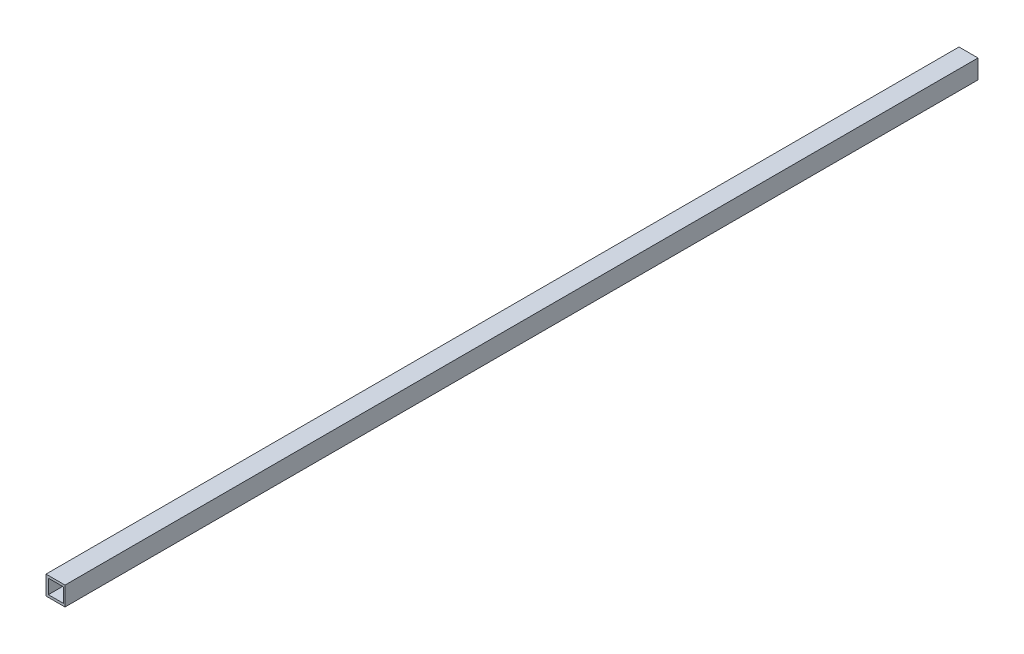
ISO-10303-21;
HEADER;
FILE_DESCRIPTION(('STEP AP214'),'2;1');
FILE_NAME('part.step','',(''),(''),'','','');
FILE_SCHEMA(('AUTOMOTIVE_DESIGN { 1 0 10303 214 1 1 1 1 }'));
ENDSEC;
DATA;
#1=APPLICATION_CONTEXT('core data for automotive mechanical design processes');
#2=APPLICATION_PROTOCOL_DEFINITION('international standard','automotive_design',2000,#1);
#3=PRODUCT_CONTEXT('',#1,'mechanical');
#4=PRODUCT('Part','Part','',(#3));
#5=PRODUCT_RELATED_PRODUCT_CATEGORY('part','',(#4));
#6=PRODUCT_DEFINITION_FORMATION('','',#4);
#7=PRODUCT_DEFINITION_CONTEXT('part definition',#1,'design');
#8=PRODUCT_DEFINITION('design','',#6,#7);
#9=PRODUCT_DEFINITION_SHAPE('','',#8);
#10=(LENGTH_UNIT() NAMED_UNIT(*) SI_UNIT(.MILLI.,.METRE.));
#11=(NAMED_UNIT(*) PLANE_ANGLE_UNIT() SI_UNIT($,.RADIAN.));
#12=(NAMED_UNIT(*) SI_UNIT($,.STERADIAN.) SOLID_ANGLE_UNIT());
#13=UNCERTAINTY_MEASURE_WITH_UNIT(LENGTH_MEASURE(1.E-05),#10,'distance_accuracy_value','');
#14=(GEOMETRIC_REPRESENTATION_CONTEXT(3) GLOBAL_UNCERTAINTY_ASSIGNED_CONTEXT((#13)) GLOBAL_UNIT_ASSIGNED_CONTEXT((#10,
#11,#12)) REPRESENTATION_CONTEXT('',''));
#15=CARTESIAN_POINT('',(0.,0.,0.));
#16=DIRECTION('',(0.,0.,1.));
#17=DIRECTION('',(1.,0.,0.));
#18=AXIS2_PLACEMENT_3D('',#15,#16,#17);
#19=CARTESIAN_POINT('',(0.,0.,1219.2));
#20=DIRECTION('',(-1.,0.,0.));
#21=DIRECTION('',(0.,-1.,0.));
#22=AXIS2_PLACEMENT_3D('',#19,#20,#21);
#23=PLANE('',#22);
#24=DIRECTION('',(0.,1.,0.));
#25=VECTOR('',#24,1.);
#26=CARTESIAN_POINT('',(0.,0.,0.));
#27=LINE('',#26,#25);
#28=CARTESIAN_POINT('',(0.,0.,0.));
#29=VERTEX_POINT('',#28);
#30=CARTESIAN_POINT('',(0.,25.4,0.));
#31=VERTEX_POINT('',#30);
#32=EDGE_CURVE('E148',#29,#31,#27,.T.);
#33=ORIENTED_EDGE('',*,*,#32,.F.);
#34=DIRECTION('',(0.,0.,-1.));
#35=VECTOR('',#34,1.);
#36=CARTESIAN_POINT('',(0.,0.,1219.2));
#37=LINE('',#36,#35);
#38=CARTESIAN_POINT('',(0.,0.,1219.2));
#39=VERTEX_POINT('',#38);
#40=EDGE_CURVE('E11',#39,#29,#37,.T.);
#41=ORIENTED_EDGE('',*,*,#40,.F.);
#42=DIRECTION('',(0.,1.,0.));
#43=VECTOR('',#42,1.);
#44=CARTESIAN_POINT('',(0.,0.,1219.2));
#45=LINE('',#44,#43);
#46=CARTESIAN_POINT('',(0.,25.4,1219.2));
#47=VERTEX_POINT('',#46);
#48=EDGE_CURVE('E154',#39,#47,#45,.T.);
#49=ORIENTED_EDGE('',*,*,#48,.T.);
#50=DIRECTION('',(0.,0.,-1.));
#51=VECTOR('',#50,1.);
#52=CARTESIAN_POINT('',(0.,25.4,1219.2));
#53=LINE('',#52,#51);
#54=EDGE_CURVE('E42',#47,#31,#53,.T.);
#55=ORIENTED_EDGE('',*,*,#54,.T.);
#56=EDGE_LOOP('',(#33,#41,#49,#55));
#57=FACE_BOUND('',#56,.T.);
#58=ADVANCED_FACE('F39',(#57),#23,.T.);
#59=CARTESIAN_POINT('',(0.,0.,1219.2));
#60=DIRECTION('',(0.,1.,0.));
#61=DIRECTION('',(0.,0.,1.));
#62=AXIS2_PLACEMENT_3D('',#59,#60,#61);
#63=PLANE('',#62);
#64=DIRECTION('',(1.,0.,0.));
#65=VECTOR('',#64,1.);
#66=CARTESIAN_POINT('',(0.,0.,0.));
#67=LINE('',#66,#65);
#68=CARTESIAN_POINT('',(25.4,0.,0.));
#69=VERTEX_POINT('',#68);
#70=EDGE_CURVE('E159',#29,#69,#67,.T.);
#71=ORIENTED_EDGE('',*,*,#70,.T.);
#72=DIRECTION('',(0.,0.,-1.));
#73=VECTOR('',#72,1.);
#74=CARTESIAN_POINT('',(25.4,0.,1219.2));
#75=LINE('',#74,#73);
#76=CARTESIAN_POINT('',(25.4,0.,1219.2));
#77=VERTEX_POINT('',#76);
#78=EDGE_CURVE('E48',#77,#69,#75,.T.);
#79=ORIENTED_EDGE('',*,*,#78,.F.);
#80=DIRECTION('',(1.,0.,0.));
#81=VECTOR('',#80,1.);
#82=CARTESIAN_POINT('',(0.,0.,1219.2));
#83=LINE('',#82,#81);
#84=EDGE_CURVE('E166',#39,#77,#83,.T.);
#85=ORIENTED_EDGE('',*,*,#84,.F.);
#86=ORIENTED_EDGE('',*,*,#40,.T.);
#87=EDGE_LOOP('',(#71,#79,#85,#86));
#88=FACE_BOUND('',#87,.T.);
#89=ADVANCED_FACE('F201',(#88),#63,.F.);
#90=CARTESIAN_POINT('',(25.4,0.,1219.2));
#91=DIRECTION('',(-1.,0.,0.));
#92=DIRECTION('',(0.,-1.,0.));
#93=AXIS2_PLACEMENT_3D('',#90,#91,#92);
#94=PLANE('',#93);
#95=DIRECTION('',(0.,1.,0.));
#96=VECTOR('',#95,1.);
#97=CARTESIAN_POINT('',(25.4,0.,0.));
#98=LINE('',#97,#96);
#99=CARTESIAN_POINT('',(25.4,25.4,0.));
#100=VERTEX_POINT('',#99);
#101=EDGE_CURVE('E176',#69,#100,#98,.T.);
#102=ORIENTED_EDGE('',*,*,#101,.T.);
#103=DIRECTION('',(0.,0.,-1.));
#104=VECTOR('',#103,1.);
#105=CARTESIAN_POINT('',(25.4,25.4,1219.2));
#106=LINE('',#105,#104);
#107=CARTESIAN_POINT('',(25.4,25.4,1219.2));
#108=VERTEX_POINT('',#107);
#109=EDGE_CURVE('E184',#108,#100,#106,.T.);
#110=ORIENTED_EDGE('',*,*,#109,.F.);
#111=DIRECTION('',(0.,1.,0.));
#112=VECTOR('',#111,1.);
#113=CARTESIAN_POINT('',(25.4,0.,1219.2));
#114=LINE('',#113,#112);
#115=EDGE_CURVE('E163',#77,#108,#114,.T.);
#116=ORIENTED_EDGE('',*,*,#115,.F.);
#117=ORIENTED_EDGE('',*,*,#78,.T.);
#118=EDGE_LOOP('',(#102,#110,#116,#117));
#119=FACE_BOUND('',#118,.T.);
#120=ADVANCED_FACE('F205',(#119),#94,.F.);
#121=CARTESIAN_POINT('',(0.,25.4,1219.2));
#122=DIRECTION('',(0.,1.,0.));
#123=DIRECTION('',(0.,0.,1.));
#124=AXIS2_PLACEMENT_3D('',#121,#122,#123);
#125=PLANE('',#124);
#126=DIRECTION('',(1.,0.,0.));
#127=VECTOR('',#126,1.);
#128=CARTESIAN_POINT('',(0.,25.4,0.));
#129=LINE('',#128,#127);
#130=EDGE_CURVE('E172',#31,#100,#129,.T.);
#131=ORIENTED_EDGE('',*,*,#130,.F.);
#132=ORIENTED_EDGE('',*,*,#54,.F.);
#133=DIRECTION('',(1.,0.,0.));
#134=VECTOR('',#133,1.);
#135=CARTESIAN_POINT('',(0.,25.4,1219.2));
#136=LINE('',#135,#134);
#137=EDGE_CURVE('E158',#47,#108,#136,.T.);
#138=ORIENTED_EDGE('',*,*,#137,.T.);
#139=ORIENTED_EDGE('',*,*,#109,.T.);
#140=EDGE_LOOP('',(#131,#132,#138,#139));
#141=FACE_BOUND('',#140,.T.);
#142=ADVANCED_FACE('F194',(#141),#125,.T.);
#143=CARTESIAN_POINT('',(0.,0.,1219.2));
#144=DIRECTION('',(0.,0.,-1.));
#145=DIRECTION('',(-1.,0.,0.));
#146=AXIS2_PLACEMENT_3D('',#143,#144,#145);
#147=PLANE('',#146);
#148=DIRECTION('',(1.,0.,0.));
#149=VECTOR('',#148,1.);
#150=CARTESIAN_POINT('',(23.4777661909682,22.225,1219.2));
#151=LINE('',#150,#149);
#152=CARTESIAN_POINT('',(3.175,22.225,1219.2));
#153=VERTEX_POINT('',#152);
#154=CARTESIAN_POINT('',(23.4777661909682,22.225,1219.2));
#155=VERTEX_POINT('',#154);
#156=EDGE_CURVE('E114',#153,#155,#151,.T.);
#157=ORIENTED_EDGE('',*,*,#156,.T.);
#158=DIRECTION('',(0.,-1.,0.));
#159=VECTOR('',#158,1.);
#160=CARTESIAN_POINT('',(23.4777661909682,22.225,1219.2));
#161=LINE('',#160,#159);
#162=CARTESIAN_POINT('',(23.4777661909682,3.175,1219.2));
#163=VERTEX_POINT('',#162);
#164=EDGE_CURVE('E107',#155,#163,#161,.T.);
#165=ORIENTED_EDGE('',*,*,#164,.T.);
#166=DIRECTION('',(-1.,0.,0.));
#167=VECTOR('',#166,1.);
#168=CARTESIAN_POINT('',(23.4777661909682,3.175,1219.2));
#169=LINE('',#168,#167);
#170=CARTESIAN_POINT('',(3.175,3.175,1219.2));
#171=VERTEX_POINT('',#170);
#172=EDGE_CURVE('E117',#163,#171,#169,.T.);
#173=ORIENTED_EDGE('',*,*,#172,.T.);
#174=DIRECTION('',(0.,1.,0.));
#175=VECTOR('',#174,1.);
#176=CARTESIAN_POINT('',(3.175,22.225,1219.2));
#177=LINE('',#176,#175);
#178=EDGE_CURVE('E56',#171,#153,#177,.T.);
#179=ORIENTED_EDGE('',*,*,#178,.T.);
#180=EDGE_LOOP('',(#157,#165,#173,#179));
#181=FACE_BOUND('',#180,.T.);
#182=ORIENTED_EDGE('',*,*,#48,.F.);
#183=ORIENTED_EDGE('',*,*,#84,.T.);
#184=ORIENTED_EDGE('',*,*,#115,.T.);
#185=ORIENTED_EDGE('',*,*,#137,.F.);
#186=EDGE_LOOP('',(#182,#183,#184,#185));
#187=FACE_BOUND('',#186,.T.);
#188=ADVANCED_FACE('F122',(#181,#187),#147,.F.);
#189=CARTESIAN_POINT('',(0.,0.,0.));
#190=DIRECTION('',(0.,0.,-1.));
#191=DIRECTION('',(-1.,0.,0.));
#192=AXIS2_PLACEMENT_3D('',#189,#190,#191);
#193=PLANE('',#192);
#194=DIRECTION('',(0.,-1.,0.));
#195=VECTOR('',#194,1.);
#196=CARTESIAN_POINT('',(23.4777661909682,22.225,0.));
#197=LINE('',#196,#195);
#198=CARTESIAN_POINT('',(23.4777661909682,22.225,0.));
#199=VERTEX_POINT('',#198);
#200=CARTESIAN_POINT('',(23.4777661909682,3.175,0.));
#201=VERTEX_POINT('',#200);
#202=EDGE_CURVE('E64',#199,#201,#197,.T.);
#203=ORIENTED_EDGE('',*,*,#202,.F.);
#204=DIRECTION('',(1.,0.,0.));
#205=VECTOR('',#204,1.);
#206=CARTESIAN_POINT('',(23.4777661909682,22.225,0.));
#207=LINE('',#206,#205);
#208=CARTESIAN_POINT('',(3.175,22.225,0.));
#209=VERTEX_POINT('',#208);
#210=EDGE_CURVE('E126',#209,#199,#207,.T.);
#211=ORIENTED_EDGE('',*,*,#210,.F.);
#212=DIRECTION('',(0.,1.,0.));
#213=VECTOR('',#212,1.);
#214=CARTESIAN_POINT('',(3.175,22.225,0.));
#215=LINE('',#214,#213);
#216=CARTESIAN_POINT('',(3.175,3.175,0.));
#217=VERTEX_POINT('',#216);
#218=EDGE_CURVE('E130',#217,#209,#215,.T.);
#219=ORIENTED_EDGE('',*,*,#218,.F.);
#220=DIRECTION('',(-1.,0.,0.));
#221=VECTOR('',#220,1.);
#222=CARTESIAN_POINT('',(23.4777661909682,3.175,0.));
#223=LINE('',#222,#221);
#224=EDGE_CURVE('E139',#201,#217,#223,.T.);
#225=ORIENTED_EDGE('',*,*,#224,.F.);
#226=EDGE_LOOP('',(#203,#211,#219,#225));
#227=FACE_BOUND('',#226,.T.);
#228=ORIENTED_EDGE('',*,*,#32,.T.);
#229=ORIENTED_EDGE('',*,*,#130,.T.);
#230=ORIENTED_EDGE('',*,*,#101,.F.);
#231=ORIENTED_EDGE('',*,*,#70,.F.);
#232=EDGE_LOOP('',(#228,#229,#230,#231));
#233=FACE_BOUND('',#232,.T.);
#234=ADVANCED_FACE('F198',(#227,#233),#193,.T.);
#235=CARTESIAN_POINT('',(23.4777661909682,22.225,1219.2));
#236=DIRECTION('',(1.,0.,0.));
#237=DIRECTION('',(0.,1.,0.));
#238=AXIS2_PLACEMENT_3D('',#235,#236,#237);
#239=PLANE('',#238);
#240=ORIENTED_EDGE('',*,*,#202,.T.);
#241=DIRECTION('',(0.,0.,-1.));
#242=VECTOR('',#241,1.);
#243=CARTESIAN_POINT('',(23.4777661909682,3.175,1219.2));
#244=LINE('',#243,#242);
#245=EDGE_CURVE('E103',#163,#201,#244,.T.);
#246=ORIENTED_EDGE('',*,*,#245,.F.);
#247=ORIENTED_EDGE('',*,*,#164,.F.);
#248=DIRECTION('',(0.,0.,-1.));
#249=VECTOR('',#248,1.);
#250=CARTESIAN_POINT('',(23.4777661909682,22.225,1219.2));
#251=LINE('',#250,#249);
#252=EDGE_CURVE('E145',#155,#199,#251,.T.);
#253=ORIENTED_EDGE('',*,*,#252,.T.);
#254=EDGE_LOOP('',(#240,#246,#247,#253));
#255=FACE_BOUND('',#254,.T.);
#256=ADVANCED_FACE('F105',(#255),#239,.F.);
#257=CARTESIAN_POINT('',(23.4777661909682,22.225,1219.2));
#258=DIRECTION('',(0.,1.,0.));
#259=DIRECTION('',(0.,0.,1.));
#260=AXIS2_PLACEMENT_3D('',#257,#258,#259);
#261=PLANE('',#260);
#262=ORIENTED_EDGE('',*,*,#210,.T.);
#263=ORIENTED_EDGE('',*,*,#252,.F.);
#264=ORIENTED_EDGE('',*,*,#156,.F.);
#265=DIRECTION('',(0.,0.,-1.));
#266=VECTOR('',#265,1.);
#267=CARTESIAN_POINT('',(3.175,22.225,1219.2));
#268=LINE('',#267,#266);
#269=EDGE_CURVE('E149',#153,#209,#268,.T.);
#270=ORIENTED_EDGE('',*,*,#269,.T.);
#271=EDGE_LOOP('',(#262,#263,#264,#270));
#272=FACE_BOUND('',#271,.T.);
#273=ADVANCED_FACE('F249',(#272),#261,.F.);
#274=CARTESIAN_POINT('',(3.175,22.225,1219.2));
#275=DIRECTION('',(-1.,0.,0.));
#276=DIRECTION('',(0.,-1.,0.));
#277=AXIS2_PLACEMENT_3D('',#274,#275,#276);
#278=PLANE('',#277);
#279=ORIENTED_EDGE('',*,*,#218,.T.);
#280=ORIENTED_EDGE('',*,*,#269,.F.);
#281=ORIENTED_EDGE('',*,*,#178,.F.);
#282=DIRECTION('',(0.,0.,-1.));
#283=VECTOR('',#282,1.);
#284=CARTESIAN_POINT('',(3.175,3.175,1219.2));
#285=LINE('',#284,#283);
#286=EDGE_CURVE('E113',#171,#217,#285,.T.);
#287=ORIENTED_EDGE('',*,*,#286,.T.);
#288=EDGE_LOOP('',(#279,#280,#281,#287));
#289=FACE_BOUND('',#288,.T.);
#290=ADVANCED_FACE('F257',(#289),#278,.F.);
#291=CARTESIAN_POINT('',(23.4777661909682,3.175,1219.2));
#292=DIRECTION('',(0.,-1.,0.));
#293=DIRECTION('',(0.,0.,-1.));
#294=AXIS2_PLACEMENT_3D('',#291,#292,#293);
#295=PLANE('',#294);
#296=ORIENTED_EDGE('',*,*,#224,.T.);
#297=ORIENTED_EDGE('',*,*,#286,.F.);
#298=ORIENTED_EDGE('',*,*,#172,.F.);
#299=ORIENTED_EDGE('',*,*,#245,.T.);
#300=EDGE_LOOP('',(#296,#297,#298,#299));
#301=FACE_BOUND('',#300,.T.);
#302=ADVANCED_FACE('F118',(#301),#295,.F.);
#303=CLOSED_SHELL('',(#58,#89,#120,#142,#188,#234,#256,#273,#290,#302));
#304=MANIFOLD_SOLID_BREP('B2',#303);
#305=ADVANCED_BREP_SHAPE_REPRESENTATION('',(#18,#304),#14);
#306=SHAPE_DEFINITION_REPRESENTATION(#9,#305);
ENDSEC;
END-ISO-10303-21;
